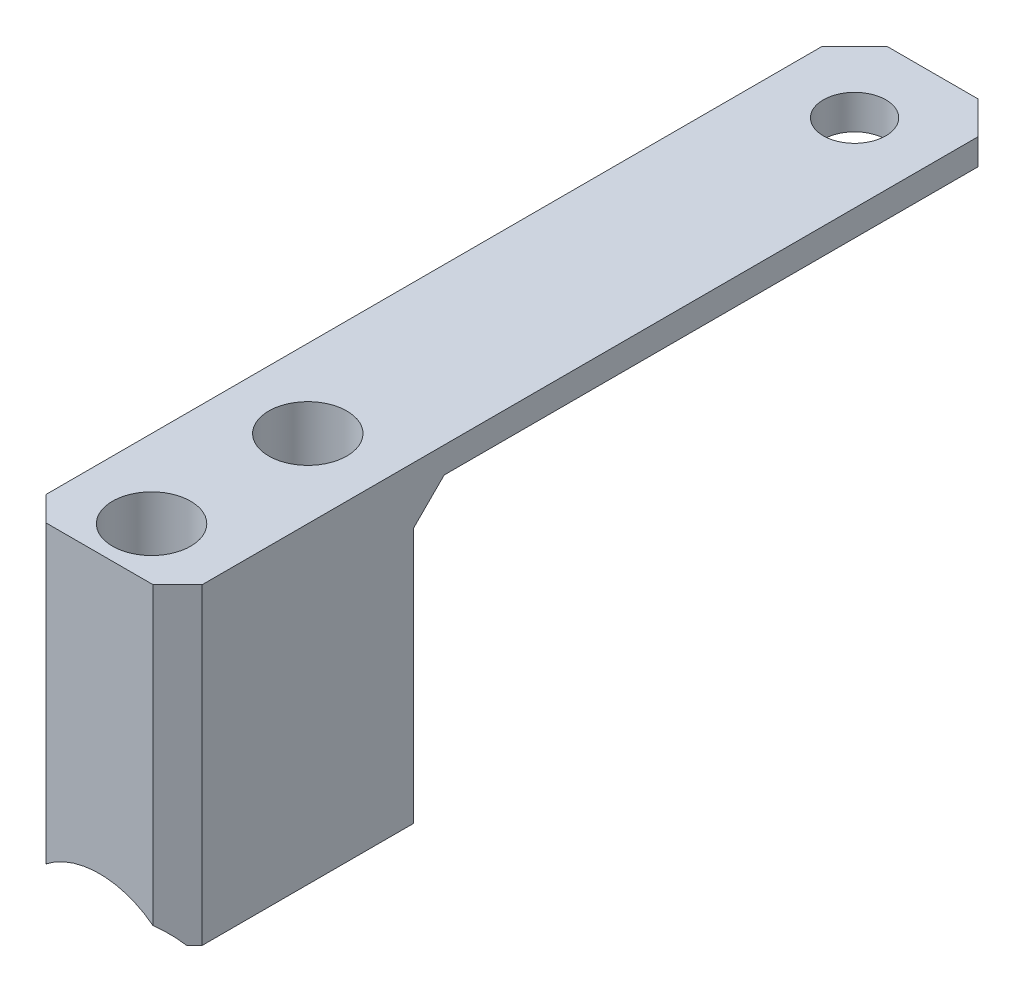
ISO-10303-21;
HEADER;
FILE_DESCRIPTION(('STEP AP214'),'2;1');
FILE_NAME('part.step','',(''),(''),'','','');
FILE_SCHEMA(('AUTOMOTIVE_DESIGN { 1 0 10303 214 1 1 1 1 }'));
ENDSEC;
DATA;
#1=APPLICATION_CONTEXT('core data for automotive mechanical design processes');
#2=APPLICATION_PROTOCOL_DEFINITION('international standard','automotive_design',2000,#1);
#3=PRODUCT_CONTEXT('',#1,'mechanical');
#4=PRODUCT('Part','Part','',(#3));
#5=PRODUCT_RELATED_PRODUCT_CATEGORY('part','',(#4));
#6=PRODUCT_DEFINITION_FORMATION('','',#4);
#7=PRODUCT_DEFINITION_CONTEXT('part definition',#1,'design');
#8=PRODUCT_DEFINITION('design','',#6,#7);
#9=PRODUCT_DEFINITION_SHAPE('','',#8);
#10=(LENGTH_UNIT() NAMED_UNIT(*) SI_UNIT(.MILLI.,.METRE.));
#11=(NAMED_UNIT(*) PLANE_ANGLE_UNIT() SI_UNIT($,.RADIAN.));
#12=(NAMED_UNIT(*) SI_UNIT($,.STERADIAN.) SOLID_ANGLE_UNIT());
#13=UNCERTAINTY_MEASURE_WITH_UNIT(LENGTH_MEASURE(1.E-05),#10,'distance_accuracy_value','');
#14=(GEOMETRIC_REPRESENTATION_CONTEXT(3) GLOBAL_UNCERTAINTY_ASSIGNED_CONTEXT((#13)) GLOBAL_UNIT_ASSIGNED_CONTEXT((#10,
#11,#12)) REPRESENTATION_CONTEXT('',''));
#15=CARTESIAN_POINT('',(0.,0.,0.));
#16=DIRECTION('',(0.,0.,1.));
#17=DIRECTION('',(1.,0.,0.));
#18=AXIS2_PLACEMENT_3D('',#15,#16,#17);
#19=CARTESIAN_POINT('',(0.,-3.175,0.));
#20=DIRECTION('',(0.,1.,0.));
#21=DIRECTION('',(0.,0.,1.));
#22=AXIS2_PLACEMENT_3D('',#19,#20,#21);
#23=PLANE('',#22);
#24=CARTESIAN_POINT('',(0.,-3.175,-41.275));
#25=DIRECTION('',(0.,1.,0.));
#26=DIRECTION('',(0.,0.,1.));
#27=AXIS2_PLACEMENT_3D('',#24,#25,#26);
#28=CIRCLE('',#27,6.81000000000001);
#29=CARTESIAN_POINT('',(0.,-3.175,-34.465));
#30=VERTEX_POINT('',#29);
#31=EDGE_CURVE('E11',#30,#30,#28,.T.);
#32=ORIENTED_EDGE('',*,*,#31,.T.);
#33=EDGE_LOOP('',(#32));
#34=FACE_BOUND('',#33,.T.);
#35=DIRECTION('',(0.,0.,-1.));
#36=VECTOR('',#35,1.);
#37=CARTESIAN_POINT('',(9.525,-3.175,0.));
#38=LINE('',#37,#36);
#39=CARTESIAN_POINT('',(9.525,-3.175,18.2926406871193));
#40=VERTEX_POINT('',#39);
#41=CARTESIAN_POINT('',(9.525,-3.175,-46.8));
#42=VERTEX_POINT('',#41);
#43=EDGE_CURVE('E255',#40,#42,#38,.T.);
#44=ORIENTED_EDGE('',*,*,#43,.F.);
#45=DIRECTION('',(0.577350269189627,0.,0.816496580927725));
#46=VECTOR('',#45,1.);
#47=CARTESIAN_POINT('',(-2.27323351711404,-3.175,1.60741883517189));
#48=LINE('',#47,#46);
#49=CARTESIAN_POINT('',(6.52499999999998,-3.175,14.05));
#50=VERTEX_POINT('',#49);
#51=EDGE_CURVE('E210',#40,#50,#48,.F.);
#52=ORIENTED_EDGE('',*,*,#51,.T.);
#53=DIRECTION('',(-1.,0.,0.));
#54=VECTOR('',#53,1.);
#55=CARTESIAN_POINT('',(-9.525,-3.175,14.05));
#56=LINE('',#55,#54);
#57=CARTESIAN_POINT('',(-6.525,-3.175,14.05));
#58=VERTEX_POINT('',#57);
#59=EDGE_CURVE('E237',#50,#58,#56,.T.);
#60=ORIENTED_EDGE('',*,*,#59,.T.);
#61=DIRECTION('',(-0.577350269189624,0.,0.816496580927727));
#62=VECTOR('',#61,1.);
#63=CARTESIAN_POINT('',(2.27323351711398,-3.175,1.60741883517184));
#64=LINE('',#63,#62);
#65=CARTESIAN_POINT('',(-9.525,-3.175,18.2926406871193));
#66=VERTEX_POINT('',#65);
#67=EDGE_CURVE('E207',#58,#66,#64,.T.);
#68=ORIENTED_EDGE('',*,*,#67,.T.);
#69=DIRECTION('',(0.,0.,-1.));
#70=VECTOR('',#69,1.);
#71=CARTESIAN_POINT('',(-9.525,-3.175,0.));
#72=LINE('',#71,#70);
#73=CARTESIAN_POINT('',(-9.525,-3.175,-46.8));
#74=VERTEX_POINT('',#73);
#75=EDGE_CURVE('E260',#66,#74,#72,.T.);
#76=ORIENTED_EDGE('',*,*,#75,.T.);
#77=DIRECTION('',(0.707106781186547,0.,-0.707106781186548));
#78=VECTOR('',#77,1.);
#79=CARTESIAN_POINT('',(-28.1625,-3.175,-28.1625));
#80=LINE('',#79,#78);
#81=CARTESIAN_POINT('',(-5.525,-3.175,-50.8));
#82=VERTEX_POINT('',#81);
#83=EDGE_CURVE('E263',#74,#82,#80,.T.);
#84=ORIENTED_EDGE('',*,*,#83,.T.);
#85=DIRECTION('',(-1.,0.,0.));
#86=VECTOR('',#85,1.);
#87=CARTESIAN_POINT('',(0.,-3.175,-50.8));
#88=LINE('',#87,#86);
#89=CARTESIAN_POINT('',(5.52500000000001,-3.175,-50.8));
#90=VERTEX_POINT('',#89);
#91=EDGE_CURVE('E308',#90,#82,#88,.T.);
#92=ORIENTED_EDGE('',*,*,#91,.F.);
#93=DIRECTION('',(-0.707106781186547,0.,-0.707106781186548));
#94=VECTOR('',#93,1.);
#95=CARTESIAN_POINT('',(28.1625,-3.175,-28.1624999999999));
#96=LINE('',#95,#94);
#97=EDGE_CURVE('E257',#42,#90,#96,.T.);
#98=ORIENTED_EDGE('',*,*,#97,.F.);
#99=EDGE_LOOP('',(#44,#52,#60,#68,#76,#84,#92,#98));
#100=FACE_BOUND('',#99,.T.);
#101=ADVANCED_FACE('F35',(#34,#100),#23,.F.);
#102=CARTESIAN_POINT('',(0.,-38.1,0.));
#103=DIRECTION('',(0.,1.,0.));
#104=DIRECTION('',(0.,0.,1.));
#105=AXIS2_PLACEMENT_3D('',#102,#103,#104);
#106=PLANE('',#105);
#107=DIRECTION('',(-0.707106781186546,0.,0.707106781186549));
#108=VECTOR('',#107,1.);
#109=CARTESIAN_POINT('',(-6.525,-38.1,19.05));
#110=LINE('',#109,#108);
#111=CARTESIAN_POINT('',(-9.525,-38.1,22.05));
#112=VERTEX_POINT('',#111);
#113=CARTESIAN_POINT('',(-8.57475364077592,-38.1,21.0997536407759));
#114=VERTEX_POINT('',#113);
#115=EDGE_CURVE('E185',#112,#114,#110,.F.);
#116=ORIENTED_EDGE('',*,*,#115,.T.);
#117=DIRECTION('',(0.,0.,1.));
#118=VECTOR('',#117,1.);
#119=CARTESIAN_POINT('',(-8.57475364077593,-38.1,-50.8));
#120=LINE('',#119,#118);
#121=CARTESIAN_POINT('',(-8.57475364077593,-38.1,48.7502463592241));
#122=VERTEX_POINT('',#121);
#123=EDGE_CURVE('E160',#114,#122,#120,.T.);
#124=ORIENTED_EDGE('',*,*,#123,.T.);
#125=DIRECTION('',(0.707106781186549,0.,0.707106781186546));
#126=VECTOR('',#125,1.);
#127=CARTESIAN_POINT('',(-9.525,-38.1,47.8));
#128=LINE('',#127,#126);
#129=CARTESIAN_POINT('',(-9.525,-38.1,47.8));
#130=VERTEX_POINT('',#129);
#131=EDGE_CURVE('E190',#122,#130,#128,.F.);
#132=ORIENTED_EDGE('',*,*,#131,.T.);
#133=DIRECTION('',(0.,0.,-1.));
#134=VECTOR('',#133,1.);
#135=CARTESIAN_POINT('',(-9.525,-38.1,0.));
#136=LINE('',#135,#134);
#137=EDGE_CURVE('E235',#130,#112,#136,.T.);
#138=ORIENTED_EDGE('',*,*,#137,.T.);
#139=EDGE_LOOP('',(#116,#124,#132,#138));
#140=FACE_BOUND('',#139,.T.);
#141=ADVANCED_FACE('F368',(#140),#106,.F.);
#142=CARTESIAN_POINT('',(2.67217354096035E-13,-38.1,44.45));
#143=DIRECTION('',(0.,1.,0.));
#144=DIRECTION('',(0.,0.,1.));
#145=AXIS2_PLACEMENT_3D('',#142,#143,#144);
#146=CYLINDRICAL_SURFACE('',#145,3.175);
#147=CARTESIAN_POINT('',(2.67217354096035E-13,-33.78,47.625));
#148=CARTESIAN_POINT('',(-0.174242814403524,-33.7800016063563,47.6249977128636));
#149=CARTESIAN_POINT('',(-0.348508787859302,-33.7843090142912,47.6106088289519));
#150=CARTESIAN_POINT('',(-0.691970102341155,-33.8010715027101,47.5535673891044));
#151=CARTESIAN_POINT('',(-0.861163843592556,-33.8135291260652,47.5109060120834));
#152=CARTESIAN_POINT('',(-1.18947688468643,-33.8452262636008,47.3988670827196));
#153=CARTESIAN_POINT('',(-1.34861051316441,-33.8644558634692,47.3295285725925));
#154=CARTESIAN_POINT('',(-1.65299261189587,-33.9076957205167,47.1662625853548));
#155=CARTESIAN_POINT('',(-1.79823929875419,-33.931706590501,47.0723319558386));
#156=CARTESIAN_POINT('',(-2.07483388226197,-33.98270507541,46.8597474698045));
#157=CARTESIAN_POINT('',(-2.20573337603713,-34.0097529461749,46.7405246825874));
#158=CARTESIAN_POINT('',(-2.44600678463925,-34.0634154779439,46.4819530189048));
#159=CARTESIAN_POINT('',(-2.55537714795902,-34.0900300668094,46.3426008283977));
#160=CARTESIAN_POINT('',(-2.75183382576003,-34.1404484588625,46.0439485239003));
#161=CARTESIAN_POINT('',(-2.83837525776291,-34.1641772937186,45.8842761369337));
#162=CARTESIAN_POINT('',(-2.9831961372184,-34.2052380451805,45.5518245121845));
#163=CARTESIAN_POINT('',(-3.04148224742319,-34.2225714696268,45.3790483754579));
#164=CARTESIAN_POINT('',(-3.12652559148753,-34.2482513628223,45.0303238926107));
#165=CARTESIAN_POINT('',(-3.15410847926706,-34.256832627068,44.8545946492116));
#166=CARTESIAN_POINT('',(-3.17954031991652,-34.2647353213482,44.5008094527301));
#167=CARTESIAN_POINT('',(-3.17739634603795,-34.2640589541572,44.3227540632076));
#168=CARTESIAN_POINT('',(-3.14408436900799,-34.2537310600309,43.9760638358909));
#169=CARTESIAN_POINT('',(-3.11394796962746,-34.24439855485,43.8073188030252));
#170=CARTESIAN_POINT('',(-3.02717222316651,-34.218325627629,43.4773970797723));
#171=CARTESIAN_POINT('',(-2.9705302986984,-34.2015844851843,43.3162211270772));
#172=CARTESIAN_POINT('',(-2.83158543541247,-34.1623240374005,43.0034768600472));
#173=CARTESIAN_POINT('',(-2.74894587290811,-34.1397296625089,42.8520679257675));
#174=CARTESIAN_POINT('',(-2.56058558848208,-34.091344974647,42.5649196327502));
#175=CARTESIAN_POINT('',(-2.45485935094687,-34.065553898594,42.4291840303794));
#176=CARTESIAN_POINT('',(-2.2181918447191,-34.0123853545694,42.1713809533137));
#177=CARTESIAN_POINT('',(-2.08639367191405,-33.9849862253869,42.0501032636012));
#178=CARTESIAN_POINT('',(-1.80398905292893,-33.9326277746101,41.8311895070105));
#179=CARTESIAN_POINT('',(-1.65338146163874,-33.9076686017244,41.7335548805776));
#180=CARTESIAN_POINT('',(-1.33621419429116,-33.8627805645264,41.5642295740701));
#181=CARTESIAN_POINT('',(-1.16955721482395,-33.8428854433382,41.492711611987));
#182=CARTESIAN_POINT('',(-0.825851762825966,-33.810610301946,41.3789517166214));
#183=CARTESIAN_POINT('',(-0.648806154470974,-33.798228220952,41.3367017548193));
#184=CARTESIAN_POINT('',(-0.29606523720601,-33.7826991463741,41.2839862732019));
#185=CARTESIAN_POINT('',(-0.120543378351676,-33.7792412080782,41.2724501169612));
#186=CARTESIAN_POINT('',(0.229938526814217,-33.7810391896263,41.2784922597607));
#187=CARTESIAN_POINT('',(0.404898643779104,-33.7862939668654,41.2960667411663));
#188=CARTESIAN_POINT('',(0.74526649770811,-33.8047235778098,41.3589645172185));
#189=CARTESIAN_POINT('',(0.910799990765495,-33.8177203577603,41.403664390886));
#190=CARTESIAN_POINT('',(1.23198339185733,-33.8501323324478,41.5187960335315));
#191=CARTESIAN_POINT('',(1.38763211635938,-33.8695482940515,41.5892308770404));
#192=CARTESIAN_POINT('',(1.6885840602721,-33.9133376315123,41.7556445227596));
#193=CARTESIAN_POINT('',(1.83356899714337,-33.9378142912549,41.8521710213492));
#194=CARTESIAN_POINT('',(2.10564867963938,-33.988913095403,42.0673607173341));
#195=CARTESIAN_POINT('',(2.23273899854053,-34.0155357681313,42.1860293753764));
#196=CARTESIAN_POINT('',(2.47012101404759,-34.0691158663523,42.4471632245208));
#197=CARTESIAN_POINT('',(2.57965135364964,-34.0960513321094,42.5903265148584));
#198=CARTESIAN_POINT('',(2.77318392601776,-34.1461957776454,42.8935858883268));
#199=CARTESIAN_POINT('',(2.85718687141616,-34.1694048614429,43.0536814986005));
#200=CARTESIAN_POINT('',(2.99669767436173,-34.2092005583236,43.3857217046014));
#201=CARTESIAN_POINT('',(3.05234190433253,-34.2258187784758,43.5576049956215));
#202=CARTESIAN_POINT('',(3.13373560461782,-34.2504684094695,43.9088870451962));
#203=CARTESIAN_POINT('',(3.15949510952644,-34.2585027025221,44.0882832601104));
#204=CARTESIAN_POINT('',(3.17971355748246,-34.2647940688896,44.4415986152637));
#205=CARTESIAN_POINT('',(3.17541218889549,-34.263438398556,44.6154408558258));
#206=CARTESIAN_POINT('',(3.13858373485585,-34.2520317938794,44.9598038961135));
#207=CARTESIAN_POINT('',(3.10605774577682,-34.2419811972873,45.1303248245911));
#208=CARTESIAN_POINT('',(3.01449775148567,-34.214574829366,45.4612142342058));
#209=CARTESIAN_POINT('',(2.95578695468378,-34.1973082859099,45.6216800848042));
#210=CARTESIAN_POINT('',(2.8137751791568,-34.1574306352711,45.9306119030521));
#211=CARTESIAN_POINT('',(2.73046955317851,-34.1348185181903,46.0790755961053));
#212=CARTESIAN_POINT('',(2.53812946026513,-34.0857841330003,46.3655543443986));
#213=CARTESIAN_POINT('',(2.42827859534501,-34.0592542123719,46.5030028475907));
#214=CARTESIAN_POINT('',(2.18744208781775,-34.0059018342335,46.7579170759829));
#215=CARTESIAN_POINT('',(2.05645099233121,-33.9790793029168,46.8753776294189));
#216=CARTESIAN_POINT('',(1.77253939367585,-33.9272443296764,47.0903264071941));
#217=CARTESIAN_POINT('',(1.61909885528973,-33.9023055959822,47.1871473455636));
#218=CARTESIAN_POINT('',(1.29737514284136,-33.8579266782272,47.3534802301977));
#219=CARTESIAN_POINT('',(1.12909916519689,-33.8384838472418,47.4230053289204));
#220=CARTESIAN_POINT('',(0.801857727050757,-33.8090486427708,47.5263179271917));
#221=CARTESIAN_POINT('',(0.643944468055328,-33.7982445742711,47.5632245780036));
#222=CARTESIAN_POINT('',(0.324027039135704,-33.7837200761291,47.6125647081558));
#223=CARTESIAN_POINT('',(0.162023531945533,-33.7799985062941,47.6250021267443));
#224=CARTESIAN_POINT('',(2.67217354096035E-13,-33.78,47.625));
#225=B_SPLINE_CURVE_WITH_KNOTS('',3,(#147,#148,#149,#150,#151,#152,#153,#154,#155,#156,#157,
#158,#159,#160,#161,#162,#163,#164,#165,#166,#167,#168,#169,#170,#171,#172,#173,#174,#175,#176,
#177,#178,#179,#180,#181,#182,#183,#184,#185,#186,#187,#188,#189,#190,#191,#192,#193,#194,#195,
#196,#197,#198,#199,#200,#201,#202,#203,#204,#205,#206,#207,#208,#209,#210,#211,#212,#213,#214,
#215,#216,#217,#218,#219,#220,#221,#222,#223,#224),.UNSPECIFIED.,.T.,.F.,(4,2,2,2,2,2,2,2,2,2,2,
2,2,2,2,2,2,2,2,2,2,2,2,2,2,2,2,2,2,2,2,2,2,2,2,2,2,2,4),(0.,0.522133369412377,1.0444297224233,
1.56596458011305,2.08756632487986,2.62245757935783,3.15743699722386,3.7042194813638,
4.25087296855068,4.78244158135374,5.31388371414041,5.82648608496219,6.3391383114146,
6.85872245372521,7.37843086542203,7.91947288720981,8.46054786349807,9.00513897767624,
9.54958064558045,10.0747790814925,10.5999086471533,11.1134036047934,11.6269599292269,
12.1522692489397,12.6777082908366,13.2218988215176,13.7660741589757,14.3076073520132,
14.8489586581504,15.3681207357232,15.8872626475637,16.4001667052771,16.9131677395615,
17.444588049563,17.9761456530488,18.5229057905199,19.06940214817,19.554997582827,
20.040514836139),.UNSPECIFIED.);
#226=CARTESIAN_POINT('',(2.67217354096035E-13,-33.78,47.625));
#227=VERTEX_POINT('',#226);
#228=EDGE_CURVE('E217',#227,#227,#225,.T.);
#229=ORIENTED_EDGE('',*,*,#228,.T.);
#230=EDGE_LOOP('',(#229));
#231=FACE_BOUND('',#230,.T.);
#232=CARTESIAN_POINT('',(2.67217354096035E-13,-25.4,44.45));
#233=DIRECTION('',(0.,1.,0.));
#234=DIRECTION('',(0.,0.,1.));
#235=AXIS2_PLACEMENT_3D('',#232,#233,#234);
#236=CIRCLE('',#235,3.175);
#237=CARTESIAN_POINT('',(2.67217354096035E-13,-25.4,47.625));
#238=VERTEX_POINT('',#237);
#239=EDGE_CURVE('E636',#238,#238,#236,.F.);
#240=ORIENTED_EDGE('',*,*,#239,.F.);
#241=EDGE_LOOP('',(#240));
#242=FACE_BOUND('',#241,.T.);
#243=ADVANCED_FACE('F392',(#231,#242),#146,.F.);
#244=CARTESIAN_POINT('',(0.,-38.1,25.4));
#245=DIRECTION('',(0.,1.,0.));
#246=DIRECTION('',(0.,0.,1.));
#247=AXIS2_PLACEMENT_3D('',#244,#245,#246);
#248=CYLINDRICAL_SURFACE('',#247,3.175);
#249=CARTESIAN_POINT('',(0.,-33.78,28.575));
#250=CARTESIAN_POINT('',(-0.174242814403791,-33.7800016063563,28.5749977128636));
#251=CARTESIAN_POINT('',(-0.34850878785957,-33.7843090142912,28.5606088289519));
#252=CARTESIAN_POINT('',(-0.691970102341425,-33.8010715027101,28.5035673891044));
#253=CARTESIAN_POINT('',(-0.861163843592827,-33.8135291260652,28.4609060120834));
#254=CARTESIAN_POINT('',(-1.1894768846867,-33.8452262636008,28.3488670827196));
#255=CARTESIAN_POINT('',(-1.34861051316468,-33.8644558634692,28.2795285725925));
#256=CARTESIAN_POINT('',(-1.65299261189614,-33.9076957205168,28.1162625853548));
#257=CARTESIAN_POINT('',(-1.79823929875446,-33.931706590501,28.0223319558386));
#258=CARTESIAN_POINT('',(-2.07483388226224,-33.9827050754101,27.8097474698045));
#259=CARTESIAN_POINT('',(-2.2057333760374,-34.009752946175,27.6905246825874));
#260=CARTESIAN_POINT('',(-2.44600678463952,-34.0634154779439,27.4319530189047));
#261=CARTESIAN_POINT('',(-2.55537714795929,-34.0900300668095,27.2926008283977));
#262=CARTESIAN_POINT('',(-2.7518338257603,-34.1404484588625,26.9939485239003));
#263=CARTESIAN_POINT('',(-2.83837525776318,-34.1641772937187,26.8342761369337));
#264=CARTESIAN_POINT('',(-2.98319613721867,-34.2052380451806,26.5018245121845));
#265=CARTESIAN_POINT('',(-3.04148224742345,-34.2225714696269,26.3290483754579));
#266=CARTESIAN_POINT('',(-3.1265255914878,-34.2482513628224,25.9803238926107));
#267=CARTESIAN_POINT('',(-3.15410847926733,-34.2568326270681,25.8045946492116));
#268=CARTESIAN_POINT('',(-3.17954031991678,-34.2647353213483,25.4508094527301));
#269=CARTESIAN_POINT('',(-3.17739634603821,-34.2640589541573,25.2727540632076));
#270=CARTESIAN_POINT('',(-3.14408436900826,-34.253731060031,24.9260638358909));
#271=CARTESIAN_POINT('',(-3.11394796962772,-34.2443985548501,24.7573188030252));
#272=CARTESIAN_POINT('',(-3.02717222316677,-34.218325627629,24.4273970797723));
#273=CARTESIAN_POINT('',(-2.97053029869866,-34.2015844851843,24.2662211270772));
#274=CARTESIAN_POINT('',(-2.83158543541273,-34.1623240374006,23.9534768600472));
#275=CARTESIAN_POINT('',(-2.74894587290837,-34.1397296625089,23.8020679257675));
#276=CARTESIAN_POINT('',(-2.56058558848235,-34.0913449746471,23.5149196327502));
#277=CARTESIAN_POINT('',(-2.45485935094714,-34.065553898594,23.3791840303795));
#278=CARTESIAN_POINT('',(-2.21819184471937,-34.0123853545695,23.1213809533137));
#279=CARTESIAN_POINT('',(-2.08639367191432,-33.984986225387,23.0001032636012));
#280=CARTESIAN_POINT('',(-1.80398905292921,-33.9326277746102,22.7811895070106));
#281=CARTESIAN_POINT('',(-1.65338146163902,-33.9076686017245,22.6835548805776));
#282=CARTESIAN_POINT('',(-1.33621419429144,-33.8627805645264,22.5142295740701));
#283=CARTESIAN_POINT('',(-1.16955721482422,-33.8428854433383,22.442711611987));
#284=CARTESIAN_POINT('',(-0.825851762826234,-33.8106103019461,22.3289517166214));
#285=CARTESIAN_POINT('',(-0.648806154471241,-33.798228220952,22.2867017548193));
#286=CARTESIAN_POINT('',(-0.296065237206276,-33.7826991463741,22.2339862732019));
#287=CARTESIAN_POINT('',(-0.12054337835194,-33.7792412080782,22.2224501169612));
#288=CARTESIAN_POINT('',(0.229938526813954,-33.7810391896263,22.2284922597607));
#289=CARTESIAN_POINT('',(0.404898643778842,-33.7862939668654,22.2460667411663));
#290=CARTESIAN_POINT('',(0.745266497707848,-33.8047235778098,22.3089645172185));
#291=CARTESIAN_POINT('',(0.910799990765232,-33.8177203577603,22.353664390886));
#292=CARTESIAN_POINT('',(1.23198339185706,-33.8501323324477,22.4687960335315));
#293=CARTESIAN_POINT('',(1.38763211635912,-33.8695482940515,22.5392308770404));
#294=CARTESIAN_POINT('',(1.68858406027183,-33.9133376315123,22.7056445227596));
#295=CARTESIAN_POINT('',(1.83356899714311,-33.9378142912549,22.8021710213492));
#296=CARTESIAN_POINT('',(2.10564867963912,-33.988913095403,23.0173607173341));
#297=CARTESIAN_POINT('',(2.23273899854027,-34.0155357681313,23.1360293753764));
#298=CARTESIAN_POINT('',(2.47012101404733,-34.0691158663523,23.3971632245208));
#299=CARTESIAN_POINT('',(2.57965135364938,-34.0960513321093,23.5403265148584));
#300=CARTESIAN_POINT('',(2.7731839260175,-34.1461957776453,23.8435858883268));
#301=CARTESIAN_POINT('',(2.85718687141589,-34.1694048614429,24.0036814986005));
#302=CARTESIAN_POINT('',(2.99669767436147,-34.2092005583236,24.3357217046014));
#303=CARTESIAN_POINT('',(3.05234190433226,-34.2258187784757,24.5076049956215));
#304=CARTESIAN_POINT('',(3.13373560461755,-34.2504684094694,24.8588870451962));
#305=CARTESIAN_POINT('',(3.15949510952618,-34.258502702522,25.0382832601104));
#306=CARTESIAN_POINT('',(3.17971355748219,-34.2647940688895,25.3915986152637));
#307=CARTESIAN_POINT('',(3.17541218889522,-34.2634383985559,25.5654408558258));
#308=CARTESIAN_POINT('',(3.13858373485559,-34.2520317938793,25.9098038961135));
#309=CARTESIAN_POINT('',(3.10605774577656,-34.2419811972872,26.0803248245911));
#310=CARTESIAN_POINT('',(3.01449775148541,-34.2145748293659,26.4112142342058));
#311=CARTESIAN_POINT('',(2.95578695468351,-34.1973082859098,26.5716800848042));
#312=CARTESIAN_POINT('',(2.81377517915653,-34.1574306352711,26.8806119030521));
#313=CARTESIAN_POINT('',(2.73046955317824,-34.1348185181903,27.0290755961053));
#314=CARTESIAN_POINT('',(2.53812946026485,-34.0857841330002,27.3155543443986));
#315=CARTESIAN_POINT('',(2.42827859534473,-34.0592542123718,27.4530028475907));
#316=CARTESIAN_POINT('',(2.18744208781747,-34.0059018342334,27.707917075983));
#317=CARTESIAN_POINT('',(2.05645099233093,-33.9790793029167,27.8253776294189));
#318=CARTESIAN_POINT('',(1.77253939367557,-33.9272443296763,28.0403264071941));
#319=CARTESIAN_POINT('',(1.61909885528945,-33.9023055959822,28.1371473455636));
#320=CARTESIAN_POINT('',(1.29737514284108,-33.8579266782272,28.3034802301977));
#321=CARTESIAN_POINT('',(1.12909916519661,-33.8384838472418,28.3730053289204));
#322=CARTESIAN_POINT('',(0.801857727050476,-33.8090486427708,28.4763179271917));
#323=CARTESIAN_POINT('',(0.643944468055049,-33.7982445742711,28.5132245780036));
#324=CARTESIAN_POINT('',(0.32402703913543,-33.7837200761291,28.5625647081558));
#325=CARTESIAN_POINT('',(0.162023531945262,-33.7799985062941,28.5750021267443));
#326=CARTESIAN_POINT('',(0.,-33.78,28.575));
#327=B_SPLINE_CURVE_WITH_KNOTS('',3,(#249,#250,#251,#252,#253,#254,#255,#256,#257,#258,#259,
#260,#261,#262,#263,#264,#265,#266,#267,#268,#269,#270,#271,#272,#273,#274,#275,#276,#277,#278,
#279,#280,#281,#282,#283,#284,#285,#286,#287,#288,#289,#290,#291,#292,#293,#294,#295,#296,#297,
#298,#299,#300,#301,#302,#303,#304,#305,#306,#307,#308,#309,#310,#311,#312,#313,#314,#315,#316,
#317,#318,#319,#320,#321,#322,#323,#324,#325,#326),.UNSPECIFIED.,.T.,.F.,(4,2,2,2,2,2,2,2,2,2,2,
2,2,2,2,2,2,2,2,2,2,2,2,2,2,2,2,2,2,2,2,2,2,2,2,2,2,2,4),(0.,0.522133369412379,1.04442972242331,
1.56596458011306,2.08756632487987,2.62245757935783,3.15743699722387,3.70421948136382,
4.2508729685507,4.78244158135376,5.31388371414044,5.82648608496222,6.33913831141462,
6.85872245372523,7.37843086542204,7.91947288720982,8.46054786349808,9.00513897767626,
9.54958064558047,10.0747790814926,10.5999086471534,11.1134036047934,11.626959929227,
12.1522692489397,12.6777082908366,13.2218988215177,13.7660741589758,14.3076073520132,
14.8489586581505,15.3681207357232,15.8872626475638,16.4001667052771,16.9131677395615,
17.444588049563,17.9761456530488,18.5229057905199,19.06940214817,19.554997582827,
20.040514836139),.UNSPECIFIED.);
#328=CARTESIAN_POINT('',(0.,-33.78,28.575));
#329=VERTEX_POINT('',#328);
#330=EDGE_CURVE('E323',#329,#329,#327,.T.);
#331=ORIENTED_EDGE('',*,*,#330,.T.);
#332=EDGE_LOOP('',(#331));
#333=FACE_BOUND('',#332,.T.);
#334=CARTESIAN_POINT('',(0.,-25.4,25.4));
#335=DIRECTION('',(0.,1.,0.));
#336=DIRECTION('',(0.,0.,1.));
#337=AXIS2_PLACEMENT_3D('',#334,#335,#336);
#338=CIRCLE('',#337,3.175);
#339=CARTESIAN_POINT('',(0.,-25.4,28.575));
#340=VERTEX_POINT('',#339);
#341=EDGE_CURVE('E289',#340,#340,#338,.F.);
#342=ORIENTED_EDGE('',*,*,#341,.F.);
#343=EDGE_LOOP('',(#342));
#344=FACE_BOUND('',#343,.T.);
#345=ADVANCED_FACE('F337',(#333,#344),#248,.F.);
#346=CARTESIAN_POINT('',(-9.525,-38.1,0.));
#347=DIRECTION('',(1.,0.,0.));
#348=DIRECTION('',(0.,0.,-1.));
#349=AXIS2_PLACEMENT_3D('',#346,#347,#348);
#350=PLANE('',#349);
#351=ORIENTED_EDGE('',*,*,#137,.F.);
#352=DIRECTION('',(0.,1.,0.));
#353=VECTOR('',#352,1.);
#354=CARTESIAN_POINT('',(-9.525,-38.1,47.8));
#355=LINE('',#354,#353);
#356=CARTESIAN_POINT('',(-9.525,0.,47.8));
#357=VERTEX_POINT('',#356);
#358=EDGE_CURVE('E271',#130,#357,#355,.T.);
#359=ORIENTED_EDGE('',*,*,#358,.T.);
#360=DIRECTION('',(0.,0.,-1.));
#361=VECTOR('',#360,1.);
#362=CARTESIAN_POINT('',(-9.525,0.,0.));
#363=LINE('',#362,#361);
#364=CARTESIAN_POINT('',(-9.525,0.,-46.8));
#365=VERTEX_POINT('',#364);
#366=EDGE_CURVE('E244',#357,#365,#363,.T.);
#367=ORIENTED_EDGE('',*,*,#366,.T.);
#368=DIRECTION('',(0.,1.,0.));
#369=VECTOR('',#368,1.);
#370=CARTESIAN_POINT('',(-9.525,-3.175,-46.8));
#371=LINE('',#370,#369);
#372=EDGE_CURVE('E247',#74,#365,#371,.T.);
#373=ORIENTED_EDGE('',*,*,#372,.F.);
#374=ORIENTED_EDGE('',*,*,#75,.F.);
#375=DIRECTION('',(0.,-0.707106781186548,0.707106781186547));
#376=VECTOR('',#375,1.);
#377=CARTESIAN_POINT('',(-9.525,-11.4911796564403,26.6088203435597));
#378=LINE('',#377,#376);
#379=CARTESIAN_POINT('',(-9.525,-6.9323593128807,22.05));
#380=VERTEX_POINT('',#379);
#381=EDGE_CURVE('E268',#66,#380,#378,.T.);
#382=ORIENTED_EDGE('',*,*,#381,.T.);
#383=DIRECTION('',(0.,-1.,0.));
#384=VECTOR('',#383,1.);
#385=CARTESIAN_POINT('',(-9.525,-38.1,22.05));
#386=LINE('',#385,#384);
#387=EDGE_CURVE('E266',#380,#112,#386,.T.);
#388=ORIENTED_EDGE('',*,*,#387,.T.);
#389=EDGE_LOOP('',(#351,#359,#367,#373,#374,#382,#388));
#390=FACE_BOUND('',#389,.T.);
#391=ADVANCED_FACE('F316',(#390),#350,.F.);
#392=CARTESIAN_POINT('',(0.,-38.1,19.05));
#393=DIRECTION('',(0.,0.,1.));
#394=DIRECTION('',(1.,0.,0.));
#395=AXIS2_PLACEMENT_3D('',#392,#393,#394);
#396=PLANE('',#395);
#397=DIRECTION('',(0.,-1.,0.));
#398=VECTOR('',#397,1.);
#399=CARTESIAN_POINT('',(6.52499999999998,-38.1,19.05));
#400=LINE('',#399,#398);
#401=CARTESIAN_POINT('',(6.52499999999998,-8.17499999999999,19.05));
#402=VERTEX_POINT('',#401);
#403=CARTESIAN_POINT('',(6.52499999999998,-36.0076499124947,19.05));
#404=VERTEX_POINT('',#403);
#405=EDGE_CURVE('E202',#402,#404,#400,.T.);
#406=ORIENTED_EDGE('',*,*,#405,.T.);
#407=CARTESIAN_POINT('',(0.,-44.45,19.05));
#408=DIRECTION('',(0.,0.,1.));
#409=DIRECTION('',(1.,0.,0.));
#410=AXIS2_PLACEMENT_3D('',#407,#408,#409);
#411=CIRCLE('',#410,10.67);
#412=CARTESIAN_POINT('',(-6.525,-36.0076499124947,19.05));
#413=VERTEX_POINT('',#412);
#414=EDGE_CURVE('E50',#404,#413,#411,.T.);
#415=ORIENTED_EDGE('',*,*,#414,.T.);
#416=DIRECTION('',(0.,1.,0.));
#417=VECTOR('',#416,1.);
#418=CARTESIAN_POINT('',(-6.525,-38.1,19.05));
#419=LINE('',#418,#417);
#420=CARTESIAN_POINT('',(-6.525,-8.17499999999999,19.05));
#421=VERTEX_POINT('',#420);
#422=EDGE_CURVE('E205',#413,#421,#419,.T.);
#423=ORIENTED_EDGE('',*,*,#422,.T.);
#424=DIRECTION('',(1.,0.,0.));
#425=VECTOR('',#424,1.);
#426=CARTESIAN_POINT('',(9.525,-8.17499999999999,19.05));
#427=LINE('',#426,#425);
#428=EDGE_CURVE('E234',#421,#402,#427,.T.);
#429=ORIENTED_EDGE('',*,*,#428,.T.);
#430=EDGE_LOOP('',(#406,#415,#423,#429));
#431=FACE_BOUND('',#430,.T.);
#432=ADVANCED_FACE('F381',(#431),#396,.F.);
#433=CARTESIAN_POINT('',(9.525,-38.1,0.));
#434=DIRECTION('',(1.,0.,0.));
#435=DIRECTION('',(0.,0.,-1.));
#436=AXIS2_PLACEMENT_3D('',#433,#434,#435);
#437=PLANE('',#436);
#438=DIRECTION('',(0.,0.,-1.));
#439=VECTOR('',#438,1.);
#440=CARTESIAN_POINT('',(9.525,0.,0.));
#441=LINE('',#440,#439);
#442=CARTESIAN_POINT('',(9.525,0.,47.8));
#443=VERTEX_POINT('',#442);
#444=CARTESIAN_POINT('',(9.525,0.,-46.8));
#445=VERTEX_POINT('',#444);
#446=EDGE_CURVE('E240',#443,#445,#441,.T.);
#447=ORIENTED_EDGE('',*,*,#446,.F.);
#448=DIRECTION('',(0.,-1.,0.));
#449=VECTOR('',#448,1.);
#450=CARTESIAN_POINT('',(9.525,-38.1,47.8));
#451=LINE('',#450,#449);
#452=CARTESIAN_POINT('',(9.525,-38.1,47.8));
#453=VERTEX_POINT('',#452);
#454=EDGE_CURVE('E197',#443,#453,#451,.T.);
#455=ORIENTED_EDGE('',*,*,#454,.T.);
#456=DIRECTION('',(0.,0.,-1.));
#457=VECTOR('',#456,1.);
#458=CARTESIAN_POINT('',(9.525,-38.1,0.));
#459=LINE('',#458,#457);
#460=CARTESIAN_POINT('',(9.525,-38.1,22.05));
#461=VERTEX_POINT('',#460);
#462=EDGE_CURVE('E233',#453,#461,#459,.T.);
#463=ORIENTED_EDGE('',*,*,#462,.T.);
#464=DIRECTION('',(0.,1.,0.));
#465=VECTOR('',#464,1.);
#466=CARTESIAN_POINT('',(9.525,-8.175,22.05));
#467=LINE('',#466,#465);
#468=CARTESIAN_POINT('',(9.525,-6.9323593128807,22.05));
#469=VERTEX_POINT('',#468);
#470=EDGE_CURVE('E192',#461,#469,#467,.T.);
#471=ORIENTED_EDGE('',*,*,#470,.T.);
#472=DIRECTION('',(0.,0.707106781186548,-0.707106781186547));
#473=VECTOR('',#472,1.);
#474=CARTESIAN_POINT('',(9.525,-1.05367965644035,16.1713203435597));
#475=LINE('',#474,#473);
#476=EDGE_CURVE('E194',#469,#40,#475,.T.);
#477=ORIENTED_EDGE('',*,*,#476,.T.);
#478=ORIENTED_EDGE('',*,*,#43,.T.);
#479=DIRECTION('',(0.,1.,0.));
#480=VECTOR('',#479,1.);
#481=CARTESIAN_POINT('',(9.525,-3.175,-46.8));
#482=LINE('',#481,#480);
#483=EDGE_CURVE('E262',#42,#445,#482,.T.);
#484=ORIENTED_EDGE('',*,*,#483,.T.);
#485=EDGE_LOOP('',(#447,#455,#463,#471,#477,#478,#484));
#486=FACE_BOUND('',#485,.T.);
#487=ADVANCED_FACE('F232',(#486),#437,.T.);
#488=CARTESIAN_POINT('',(0.,-38.1,50.8));
#489=DIRECTION('',(0.,0.,-1.));
#490=DIRECTION('',(-1.,0.,0.));
#491=AXIS2_PLACEMENT_3D('',#488,#489,#490);
#492=PLANE('',#491);
#493=DIRECTION('',(0.,-1.,0.));
#494=VECTOR('',#493,1.);
#495=CARTESIAN_POINT('',(-6.52499999999999,-38.1,50.8));
#496=LINE('',#495,#494);
#497=CARTESIAN_POINT('',(-6.52499999999999,0.,50.8));
#498=VERTEX_POINT('',#497);
#499=CARTESIAN_POINT('',(-6.52499999999999,-36.0076499124947,50.8));
#500=VERTEX_POINT('',#499);
#501=EDGE_CURVE('E170',#498,#500,#496,.T.);
#502=ORIENTED_EDGE('',*,*,#501,.T.);
#503=CARTESIAN_POINT('',(0.,-44.45,50.8));
#504=DIRECTION('',(0.,0.,1.));
#505=DIRECTION('',(1.,0.,0.));
#506=AXIS2_PLACEMENT_3D('',#503,#504,#505);
#507=CIRCLE('',#506,10.67);
#508=CARTESIAN_POINT('',(6.525,-36.0076499124947,50.8));
#509=VERTEX_POINT('',#508);
#510=EDGE_CURVE('E152',#509,#500,#507,.T.);
#511=ORIENTED_EDGE('',*,*,#510,.F.);
#512=DIRECTION('',(0.,1.,0.));
#513=VECTOR('',#512,1.);
#514=CARTESIAN_POINT('',(6.525,0.,50.8));
#515=LINE('',#514,#513);
#516=CARTESIAN_POINT('',(6.525,0.,50.8));
#517=VERTEX_POINT('',#516);
#518=EDGE_CURVE('E167',#509,#517,#515,.T.);
#519=ORIENTED_EDGE('',*,*,#518,.T.);
#520=DIRECTION('',(-1.,0.,0.));
#521=VECTOR('',#520,1.);
#522=CARTESIAN_POINT('',(0.,0.,50.8));
#523=LINE('',#522,#521);
#524=EDGE_CURVE('E246',#517,#498,#523,.T.);
#525=ORIENTED_EDGE('',*,*,#524,.T.);
#526=EDGE_LOOP('',(#502,#511,#519,#525));
#527=FACE_BOUND('',#526,.T.);
#528=ADVANCED_FACE('F165',(#527),#492,.F.);
#529=DIRECTION('',(-0.707106781186546,0.,0.707106781186549));
#530=VECTOR('',#529,1.);
#531=CARTESIAN_POINT('',(6.525,-38.1,50.8));
#532=LINE('',#531,#530);
#533=CARTESIAN_POINT('',(8.57475364077594,-38.1,48.7502463592241));
#534=VERTEX_POINT('',#533);
#535=EDGE_CURVE('E188',#453,#534,#532,.T.);
#536=ORIENTED_EDGE('',*,*,#535,.T.);
#537=DIRECTION('',(0.,0.,1.));
#538=VECTOR('',#537,1.);
#539=CARTESIAN_POINT('',(8.57475364077594,-38.1,-50.8));
#540=LINE('',#539,#538);
#541=CARTESIAN_POINT('',(8.57475364077594,-38.1,21.099753640776));
#542=VERTEX_POINT('',#541);
#543=EDGE_CURVE('E155',#534,#542,#540,.F.);
#544=ORIENTED_EDGE('',*,*,#543,.T.);
#545=DIRECTION('',(0.70710678118655,0.,0.707106781186545));
#546=VECTOR('',#545,1.);
#547=CARTESIAN_POINT('',(9.525,-38.1,22.05));
#548=LINE('',#547,#546);
#549=EDGE_CURVE('E179',#542,#461,#548,.T.);
#550=ORIENTED_EDGE('',*,*,#549,.T.);
#551=ORIENTED_EDGE('',*,*,#462,.F.);
#552=EDGE_LOOP('',(#536,#544,#550,#551));
#553=FACE_BOUND('',#552,.T.);
#554=ADVANCED_FACE('F222',(#553),#106,.F.);
#555=CARTESIAN_POINT('',(0.,0.,0.));
#556=DIRECTION('',(0.,1.,0.));
#557=DIRECTION('',(0.,0.,1.));
#558=AXIS2_PLACEMENT_3D('',#555,#556,#557);
#559=PLANE('',#558);
#560=CARTESIAN_POINT('',(0.,0.,-41.275));
#561=DIRECTION('',(0.,1.,0.));
#562=DIRECTION('',(0.,0.,1.));
#563=AXIS2_PLACEMENT_3D('',#560,#561,#562);
#564=CIRCLE('',#563,3.81);
#565=CARTESIAN_POINT('',(0.,0.,-37.465));
#566=VERTEX_POINT('',#565);
#567=EDGE_CURVE('E171',#566,#566,#564,.T.);
#568=ORIENTED_EDGE('',*,*,#567,.F.);
#569=EDGE_LOOP('',(#568));
#570=FACE_BOUND('',#569,.T.);
#571=CARTESIAN_POINT('',(2.67217354096035E-13,0.,44.45));
#572=DIRECTION('',(0.,1.,0.));
#573=DIRECTION('',(0.,0.,1.));
#574=AXIS2_PLACEMENT_3D('',#571,#572,#573);
#575=CIRCLE('',#574,4.7625);
#576=CARTESIAN_POINT('',(2.67217354096035E-13,0.,49.2125));
#577=VERTEX_POINT('',#576);
#578=EDGE_CURVE('E214',#577,#577,#575,.T.);
#579=ORIENTED_EDGE('',*,*,#578,.F.);
#580=EDGE_LOOP('',(#579));
#581=FACE_BOUND('',#580,.T.);
#582=CARTESIAN_POINT('',(0.,0.,25.4));
#583=DIRECTION('',(0.,1.,0.));
#584=DIRECTION('',(0.,0.,1.));
#585=AXIS2_PLACEMENT_3D('',#582,#583,#584);
#586=CIRCLE('',#585,4.7625);
#587=CARTESIAN_POINT('',(0.,0.,30.1625));
#588=VERTEX_POINT('',#587);
#589=EDGE_CURVE('E633',#588,#588,#586,.T.);
#590=ORIENTED_EDGE('',*,*,#589,.F.);
#591=EDGE_LOOP('',(#590));
#592=FACE_BOUND('',#591,.T.);
#593=ORIENTED_EDGE('',*,*,#366,.F.);
#594=DIRECTION('',(-0.707106781186549,0.,-0.707106781186546));
#595=VECTOR('',#594,1.);
#596=CARTESIAN_POINT('',(-28.6625,0.,28.6625000000001));
#597=LINE('',#596,#595);
#598=EDGE_CURVE('E177',#357,#498,#597,.F.);
#599=ORIENTED_EDGE('',*,*,#598,.T.);
#600=ORIENTED_EDGE('',*,*,#524,.F.);
#601=DIRECTION('',(0.707106781186546,0.,-0.707106781186549));
#602=VECTOR('',#601,1.);
#603=CARTESIAN_POINT('',(28.6625,0.,28.6624999999999));
#604=LINE('',#603,#602);
#605=EDGE_CURVE('E175',#517,#443,#604,.T.);
#606=ORIENTED_EDGE('',*,*,#605,.T.);
#607=ORIENTED_EDGE('',*,*,#446,.T.);
#608=DIRECTION('',(-0.707106781186547,0.,-0.707106781186548));
#609=VECTOR('',#608,1.);
#610=CARTESIAN_POINT('',(28.1625,0.,-28.1624999999999));
#611=LINE('',#610,#609);
#612=CARTESIAN_POINT('',(5.52500000000001,0.,-50.8));
#613=VERTEX_POINT('',#612);
#614=EDGE_CURVE('E284',#445,#613,#611,.T.);
#615=ORIENTED_EDGE('',*,*,#614,.T.);
#616=DIRECTION('',(-1.,0.,0.));
#617=VECTOR('',#616,1.);
#618=CARTESIAN_POINT('',(0.,0.,-50.8));
#619=LINE('',#618,#617);
#620=CARTESIAN_POINT('',(-5.525,0.,-50.8));
#621=VERTEX_POINT('',#620);
#622=EDGE_CURVE('E288',#613,#621,#619,.T.);
#623=ORIENTED_EDGE('',*,*,#622,.T.);
#624=DIRECTION('',(0.707106781186547,0.,-0.707106781186548));
#625=VECTOR('',#624,1.);
#626=CARTESIAN_POINT('',(-28.1625,0.,-28.1625));
#627=LINE('',#626,#625);
#628=EDGE_CURVE('E258',#365,#621,#627,.T.);
#629=ORIENTED_EDGE('',*,*,#628,.F.);
#630=EDGE_LOOP('',(#593,#599,#600,#606,#607,#615,#623,#629));
#631=FACE_BOUND('',#630,.T.);
#632=ADVANCED_FACE('F275',(#570,#581,#592,#631),#559,.T.);
#633=CARTESIAN_POINT('',(-28.1625,-3.175,-28.1625));
#634=DIRECTION('',(0.707106781186548,0.,0.707106781186547));
#635=DIRECTION('',(0.707106781186547,0.,-0.707106781186548));
#636=AXIS2_PLACEMENT_3D('',#633,#634,#635);
#637=PLANE('',#636);
#638=ORIENTED_EDGE('',*,*,#628,.T.);
#639=DIRECTION('',(0.,1.,0.));
#640=VECTOR('',#639,1.);
#641=CARTESIAN_POINT('',(-5.525,-3.175,-50.8));
#642=LINE('',#641,#640);
#643=EDGE_CURVE('E301',#82,#621,#642,.T.);
#644=ORIENTED_EDGE('',*,*,#643,.F.);
#645=ORIENTED_EDGE('',*,*,#83,.F.);
#646=ORIENTED_EDGE('',*,*,#372,.T.);
#647=EDGE_LOOP('',(#638,#644,#645,#646));
#648=FACE_BOUND('',#647,.T.);
#649=ADVANCED_FACE('F312',(#648),#637,.F.);
#650=CARTESIAN_POINT('',(0.,-3.175,-50.8));
#651=DIRECTION('',(0.,0.,-1.));
#652=DIRECTION('',(-1.,0.,0.));
#653=AXIS2_PLACEMENT_3D('',#650,#651,#652);
#654=PLANE('',#653);
#655=ORIENTED_EDGE('',*,*,#622,.F.);
#656=DIRECTION('',(0.,1.,0.));
#657=VECTOR('',#656,1.);
#658=CARTESIAN_POINT('',(5.52500000000001,-3.175,-50.8));
#659=LINE('',#658,#657);
#660=EDGE_CURVE('E283',#90,#613,#659,.T.);
#661=ORIENTED_EDGE('',*,*,#660,.F.);
#662=ORIENTED_EDGE('',*,*,#91,.T.);
#663=ORIENTED_EDGE('',*,*,#643,.T.);
#664=EDGE_LOOP('',(#655,#661,#662,#663));
#665=FACE_BOUND('',#664,.T.);
#666=ADVANCED_FACE('F306',(#665),#654,.T.);
#667=CARTESIAN_POINT('',(28.1625,-3.175,-28.1624999999999));
#668=DIRECTION('',(0.707106781186548,0.,-0.707106781186547));
#669=DIRECTION('',(-0.707106781186547,0.,-0.707106781186548));
#670=AXIS2_PLACEMENT_3D('',#667,#668,#669);
#671=PLANE('',#670);
#672=ORIENTED_EDGE('',*,*,#614,.F.);
#673=ORIENTED_EDGE('',*,*,#483,.F.);
#674=ORIENTED_EDGE('',*,*,#97,.T.);
#675=ORIENTED_EDGE('',*,*,#660,.T.);
#676=EDGE_LOOP('',(#672,#673,#674,#675));
#677=FACE_BOUND('',#676,.T.);
#678=ADVANCED_FACE('F285',(#677),#671,.T.);
#679=CARTESIAN_POINT('',(0.,-25.4,25.4));
#680=DIRECTION('',(0.,1.,0.));
#681=DIRECTION('',(0.,0.,1.));
#682=AXIS2_PLACEMENT_3D('',#679,#680,#681);
#683=PLANE('',#682);
#684=CARTESIAN_POINT('',(0.,-25.4,25.4));
#685=DIRECTION('',(0.,1.,0.));
#686=DIRECTION('',(0.,0.,1.));
#687=AXIS2_PLACEMENT_3D('',#684,#685,#686);
#688=CIRCLE('',#687,4.7625);
#689=CARTESIAN_POINT('',(0.,-25.4,30.1625));
#690=VERTEX_POINT('',#689);
#691=EDGE_CURVE('E293',#690,#690,#688,.T.);
#692=ORIENTED_EDGE('',*,*,#691,.T.);
#693=EDGE_LOOP('',(#692));
#694=FACE_BOUND('',#693,.T.);
#695=ORIENTED_EDGE('',*,*,#341,.T.);
#696=EDGE_LOOP('',(#695));
#697=FACE_BOUND('',#696,.T.);
#698=ADVANCED_FACE('F359',(#694,#697),#683,.T.);
#699=CARTESIAN_POINT('',(0.,-25.4,25.4));
#700=DIRECTION('',(0.,1.,0.));
#701=DIRECTION('',(0.,0.,1.));
#702=AXIS2_PLACEMENT_3D('',#699,#700,#701);
#703=CYLINDRICAL_SURFACE('',#702,4.7625);
#704=ORIENTED_EDGE('',*,*,#691,.F.);
#705=EDGE_LOOP('',(#704));
#706=FACE_BOUND('',#705,.T.);
#707=ORIENTED_EDGE('',*,*,#589,.T.);
#708=EDGE_LOOP('',(#707));
#709=FACE_BOUND('',#708,.T.);
#710=ADVANCED_FACE('F353',(#706,#709),#703,.F.);
#711=CARTESIAN_POINT('',(2.67217354096035E-13,-25.4,44.45));
#712=DIRECTION('',(0.,1.,0.));
#713=DIRECTION('',(0.,0.,1.));
#714=AXIS2_PLACEMENT_3D('',#711,#712,#713);
#715=PLANE('',#714);
#716=CARTESIAN_POINT('',(2.67217354096035E-13,-25.4,44.45));
#717=DIRECTION('',(0.,1.,0.));
#718=DIRECTION('',(0.,0.,1.));
#719=AXIS2_PLACEMENT_3D('',#716,#717,#718);
#720=CIRCLE('',#719,4.7625);
#721=CARTESIAN_POINT('',(2.67217354096035E-13,-25.4,49.2125));
#722=VERTEX_POINT('',#721);
#723=EDGE_CURVE('E640',#722,#722,#720,.T.);
#724=ORIENTED_EDGE('',*,*,#723,.T.);
#725=EDGE_LOOP('',(#724));
#726=FACE_BOUND('',#725,.T.);
#727=ORIENTED_EDGE('',*,*,#239,.T.);
#728=EDGE_LOOP('',(#727));
#729=FACE_BOUND('',#728,.T.);
#730=ADVANCED_FACE('F348',(#726,#729),#715,.T.);
#731=CARTESIAN_POINT('',(2.67217354096035E-13,-25.4,44.45));
#732=DIRECTION('',(0.,1.,0.));
#733=DIRECTION('',(0.,0.,1.));
#734=AXIS2_PLACEMENT_3D('',#731,#732,#733);
#735=CYLINDRICAL_SURFACE('',#734,4.7625);
#736=ORIENTED_EDGE('',*,*,#723,.F.);
#737=EDGE_LOOP('',(#736));
#738=FACE_BOUND('',#737,.T.);
#739=ORIENTED_EDGE('',*,*,#578,.T.);
#740=EDGE_LOOP('',(#739));
#741=FACE_BOUND('',#740,.T.);
#742=ADVANCED_FACE('F352',(#738,#741),#735,.F.);
#743=CARTESIAN_POINT('',(0.,-8.17499999999999,19.05));
#744=DIRECTION('',(0.,-0.707106781186547,-0.707106781186548));
#745=DIRECTION('',(-1.,0.,0.));
#746=AXIS2_PLACEMENT_3D('',#743,#744,#745);
#747=PLANE('',#746);
#748=ORIENTED_EDGE('',*,*,#428,.F.);
#749=DIRECTION('',(0.,-0.707106781186548,0.707106781186547));
#750=VECTOR('',#749,1.);
#751=CARTESIAN_POINT('',(-6.525,-8.17499999999999,19.05));
#752=LINE('',#751,#750);
#753=EDGE_CURVE('E200',#421,#58,#752,.F.);
#754=ORIENTED_EDGE('',*,*,#753,.T.);
#755=ORIENTED_EDGE('',*,*,#59,.F.);
#756=DIRECTION('',(0.,0.707106781186548,-0.707106781186547));
#757=VECTOR('',#756,1.);
#758=CARTESIAN_POINT('',(6.52499999999998,-8.175,19.05));
#759=LINE('',#758,#757);
#760=EDGE_CURVE('E58',#50,#402,#759,.F.);
#761=ORIENTED_EDGE('',*,*,#760,.T.);
#762=EDGE_LOOP('',(#748,#754,#755,#761));
#763=FACE_BOUND('',#762,.T.);
#764=ADVANCED_FACE('F357',(#763),#747,.T.);
#765=CARTESIAN_POINT('',(-9.525,-38.1,47.8));
#766=DIRECTION('',(0.707106781186546,0.,-0.707106781186549));
#767=DIRECTION('',(0.,1.,0.));
#768=AXIS2_PLACEMENT_3D('',#765,#766,#767);
#769=PLANE('',#768);
#770=CARTESIAN_POINT('',(0.,-44.45,57.325));
#771=DIRECTION('',(0.707106781186546,0.,-0.707106781186549));
#772=DIRECTION('',(0.707106781186549,0.,0.707106781186546));
#773=AXIS2_PLACEMENT_3D('',#770,#771,#772);
#774=ELLIPSE('',#773,15.0896587105209,10.67);
#775=EDGE_CURVE('E321',#500,#122,#774,.F.);
#776=ORIENTED_EDGE('',*,*,#775,.F.);
#777=ORIENTED_EDGE('',*,*,#501,.F.);
#778=ORIENTED_EDGE('',*,*,#598,.F.);
#779=ORIENTED_EDGE('',*,*,#358,.F.);
#780=ORIENTED_EDGE('',*,*,#131,.F.);
#781=EDGE_LOOP('',(#776,#777,#778,#779,#780));
#782=FACE_BOUND('',#781,.T.);
#783=ADVANCED_FACE('F320',(#782),#769,.F.);
#784=CARTESIAN_POINT('',(6.525,-38.1,50.8));
#785=DIRECTION('',(0.707106781186549,0.,0.707106781186546));
#786=DIRECTION('',(0.,-1.,0.));
#787=AXIS2_PLACEMENT_3D('',#784,#785,#786);
#788=PLANE('',#787);
#789=CARTESIAN_POINT('',(0.,-44.45,57.325));
#790=DIRECTION('',(0.707106781186549,0.,0.707106781186546));
#791=DIRECTION('',(-0.707106781186546,0.,0.707106781186549));
#792=AXIS2_PLACEMENT_3D('',#789,#790,#791);
#793=ELLIPSE('',#792,15.089658710521,10.67);
#794=EDGE_CURVE('E148',#534,#509,#793,.T.);
#795=ORIENTED_EDGE('',*,*,#794,.F.);
#796=ORIENTED_EDGE('',*,*,#535,.F.);
#797=ORIENTED_EDGE('',*,*,#454,.F.);
#798=ORIENTED_EDGE('',*,*,#605,.F.);
#799=ORIENTED_EDGE('',*,*,#518,.F.);
#800=EDGE_LOOP('',(#795,#796,#797,#798,#799));
#801=FACE_BOUND('',#800,.T.);
#802=ADVANCED_FACE('F173',(#801),#788,.T.);
#803=CARTESIAN_POINT('',(-6.525,-38.1,19.05));
#804=DIRECTION('',(0.707106781186549,0.,0.707106781186546));
#805=DIRECTION('',(0.,1.,0.));
#806=AXIS2_PLACEMENT_3D('',#803,#804,#805);
#807=PLANE('',#806);
#808=CARTESIAN_POINT('',(0.,-44.45,12.525));
#809=DIRECTION('',(0.707106781186549,0.,0.707106781186546));
#810=DIRECTION('',(-0.707106781186546,0.,0.707106781186549));
#811=AXIS2_PLACEMENT_3D('',#808,#809,#810);
#812=ELLIPSE('',#811,15.089658710521,10.67);
#813=EDGE_CURVE('E161',#114,#413,#812,.F.);
#814=ORIENTED_EDGE('',*,*,#813,.F.);
#815=ORIENTED_EDGE('',*,*,#115,.F.);
#816=ORIENTED_EDGE('',*,*,#387,.F.);
#817=DIRECTION('',(-0.678598344545845,0.281084637714822,0.678598344545848));
#818=VECTOR('',#817,1.);
#819=CARTESIAN_POINT('',(-10.7547515590043,-6.42297953879165,23.2797515590043));
#820=LINE('',#819,#818);
#821=EDGE_CURVE('E212',#421,#380,#820,.T.);
#822=ORIENTED_EDGE('',*,*,#821,.F.);
#823=ORIENTED_EDGE('',*,*,#422,.F.);
#824=EDGE_LOOP('',(#814,#815,#816,#822,#823));
#825=FACE_BOUND('',#824,.T.);
#826=ADVANCED_FACE('F416',(#825),#807,.F.);
#827=CARTESIAN_POINT('',(-9.525,-11.4911796564403,26.6088203435597));
#828=DIRECTION('',(-0.707106781186549,-0.499999999999999,-0.499999999999999));
#829=DIRECTION('',(0.,0.707106781186548,-0.707106781186547));
#830=AXIS2_PLACEMENT_3D('',#827,#828,#829);
#831=PLANE('',#830);
#832=ORIENTED_EDGE('',*,*,#67,.F.);
#833=ORIENTED_EDGE('',*,*,#753,.F.);
#834=ORIENTED_EDGE('',*,*,#821,.T.);
#835=ORIENTED_EDGE('',*,*,#381,.F.);
#836=EDGE_LOOP('',(#832,#833,#834,#835));
#837=FACE_BOUND('',#836,.T.);
#838=ADVANCED_FACE('F417',(#837),#831,.T.);
#839=CARTESIAN_POINT('',(9.525,-38.1,22.05));
#840=DIRECTION('',(0.707106781186545,0.,-0.70710678118655));
#841=DIRECTION('',(0.,-1.,0.));
#842=AXIS2_PLACEMENT_3D('',#839,#840,#841);
#843=PLANE('',#842);
#844=CARTESIAN_POINT('',(0.,-44.45,12.5250000000001));
#845=DIRECTION('',(0.707106781186545,0.,-0.70710678118655));
#846=DIRECTION('',(0.70710678118655,0.,0.707106781186545));
#847=AXIS2_PLACEMENT_3D('',#844,#845,#846);
#848=ELLIPSE('',#847,15.0896587105209,10.67);
#849=EDGE_CURVE('E43',#404,#542,#848,.T.);
#850=ORIENTED_EDGE('',*,*,#849,.F.);
#851=ORIENTED_EDGE('',*,*,#405,.F.);
#852=DIRECTION('',(-0.678598344545849,-0.281084637714821,-0.678598344545845));
#853=VECTOR('',#852,1.);
#854=CARTESIAN_POINT('',(10.7547515590043,-6.42297953879165,23.2797515590043));
#855=LINE('',#854,#853);
#856=EDGE_CURVE('E215',#469,#402,#855,.T.);
#857=ORIENTED_EDGE('',*,*,#856,.F.);
#858=ORIENTED_EDGE('',*,*,#470,.F.);
#859=ORIENTED_EDGE('',*,*,#549,.F.);
#860=EDGE_LOOP('',(#850,#851,#857,#858,#859));
#861=FACE_BOUND('',#860,.T.);
#862=ADVANCED_FACE('F227',(#861),#843,.T.);
#863=CARTESIAN_POINT('',(9.525,-11.4911796564404,26.6088203435597));
#864=DIRECTION('',(-0.707106781186546,0.500000000000001,0.500000000000001));
#865=DIRECTION('',(0.,0.707106781186548,-0.707106781186547));
#866=AXIS2_PLACEMENT_3D('',#863,#864,#865);
#867=PLANE('',#866);
#868=ORIENTED_EDGE('',*,*,#856,.T.);
#869=ORIENTED_EDGE('',*,*,#760,.F.);
#870=ORIENTED_EDGE('',*,*,#51,.F.);
#871=ORIENTED_EDGE('',*,*,#476,.F.);
#872=EDGE_LOOP('',(#868,#869,#870,#871));
#873=FACE_BOUND('',#872,.T.);
#874=ADVANCED_FACE('F345',(#873),#867,.F.);
#875=CARTESIAN_POINT('',(0.,-44.45,-50.8));
#876=DIRECTION('',(0.,0.,1.));
#877=DIRECTION('',(1.,0.,0.));
#878=AXIS2_PLACEMENT_3D('',#875,#876,#877);
#879=CYLINDRICAL_SURFACE('',#878,10.67);
#880=ORIENTED_EDGE('',*,*,#330,.F.);
#881=EDGE_LOOP('',(#880));
#882=FACE_BOUND('',#881,.T.);
#883=ORIENTED_EDGE('',*,*,#775,.T.);
#884=ORIENTED_EDGE('',*,*,#123,.F.);
#885=ORIENTED_EDGE('',*,*,#813,.T.);
#886=ORIENTED_EDGE('',*,*,#414,.F.);
#887=ORIENTED_EDGE('',*,*,#849,.T.);
#888=ORIENTED_EDGE('',*,*,#543,.F.);
#889=ORIENTED_EDGE('',*,*,#794,.T.);
#890=ORIENTED_EDGE('',*,*,#510,.T.);
#891=EDGE_LOOP('',(#883,#884,#885,#886,#887,#888,#889,#890));
#892=FACE_BOUND('',#891,.T.);
#893=ORIENTED_EDGE('',*,*,#228,.F.);
#894=EDGE_LOOP('',(#893));
#895=FACE_BOUND('',#894,.T.);
#896=ADVANCED_FACE('F150',(#882,#892,#895),#879,.F.);
#897=CARTESIAN_POINT('',(0.,2.,-41.275));
#898=DIRECTION('',(0.,-1.,0.));
#899=DIRECTION('',(0.,0.,-1.));
#900=AXIS2_PLACEMENT_3D('',#897,#898,#899);
#901=CYLINDRICAL_SURFACE('',#900,3.81);
#902=ORIENTED_EDGE('',*,*,#567,.T.);
#903=EDGE_LOOP('',(#902));
#904=FACE_BOUND('',#903,.T.);
#905=CARTESIAN_POINT('',(0.,-4.175,-41.275));
#906=DIRECTION('',(0.,-1.,0.));
#907=DIRECTION('',(0.,0.,-1.));
#908=AXIS2_PLACEMENT_3D('',#905,#906,#907);
#909=CIRCLE('',#908,3.81);
#910=CARTESIAN_POINT('',(0.,-4.175,-45.085));
#911=VERTEX_POINT('',#910);
#912=EDGE_CURVE('E613',#911,#911,#909,.T.);
#913=ORIENTED_EDGE('',*,*,#912,.T.);
#914=EDGE_LOOP('',(#913));
#915=FACE_BOUND('',#914,.T.);
#916=ADVANCED_FACE('F344',(#904,#915),#901,.F.);
#917=CARTESIAN_POINT('',(0.,-4.175,-41.275));
#918=DIRECTION('',(0.,-1.,0.));
#919=DIRECTION('',(0.,0.,-1.));
#920=AXIS2_PLACEMENT_3D('',#917,#918,#919);
#921=PLANE('',#920);
#922=CARTESIAN_POINT('',(0.,-4.175,-41.275));
#923=DIRECTION('',(0.,-1.,0.));
#924=DIRECTION('',(0.,0.,-1.));
#925=AXIS2_PLACEMENT_3D('',#922,#923,#924);
#926=CIRCLE('',#925,5.81);
#927=CARTESIAN_POINT('',(0.,-4.175,-47.085));
#928=VERTEX_POINT('',#927);
#929=EDGE_CURVE('E612',#928,#928,#926,.T.);
#930=ORIENTED_EDGE('',*,*,#929,.T.);
#931=EDGE_LOOP('',(#930));
#932=FACE_BOUND('',#931,.T.);
#933=ORIENTED_EDGE('',*,*,#912,.F.);
#934=EDGE_LOOP('',(#933));
#935=FACE_BOUND('',#934,.T.);
#936=ADVANCED_FACE('F448',(#932,#935),#921,.T.);
#937=CARTESIAN_POINT('',(0.,-4.17500000000002,-41.275));
#938=DIRECTION('',(0.,1.,0.));
#939=DIRECTION('',(0.,0.,1.));
#940=AXIS2_PLACEMENT_3D('',#937,#938,#939);
#941=CONICAL_SURFACE('',#940,5.81,0.785398163397444);
#942=ORIENTED_EDGE('',*,*,#31,.F.);
#943=EDGE_LOOP('',(#942));
#944=FACE_BOUND('',#943,.T.);
#945=ORIENTED_EDGE('',*,*,#929,.F.);
#946=EDGE_LOOP('',(#945));
#947=FACE_BOUND('',#946,.T.);
#948=ADVANCED_FACE('F37',(#944,#947),#941,.T.);
#949=CLOSED_SHELL('',(#101,#141,#243,#345,#391,#432,#487,#528,#554,#632,#649,#666,#678,#698,
#710,#730,#742,#764,#783,#802,#826,#838,#862,#874,#896,#916,#936,#948));
#950=MANIFOLD_SOLID_BREP('B2',#949);
#951=ADVANCED_BREP_SHAPE_REPRESENTATION('',(#18,#950),#14);
#952=SHAPE_DEFINITION_REPRESENTATION(#9,#951);
ENDSEC;
END-ISO-10303-21;
